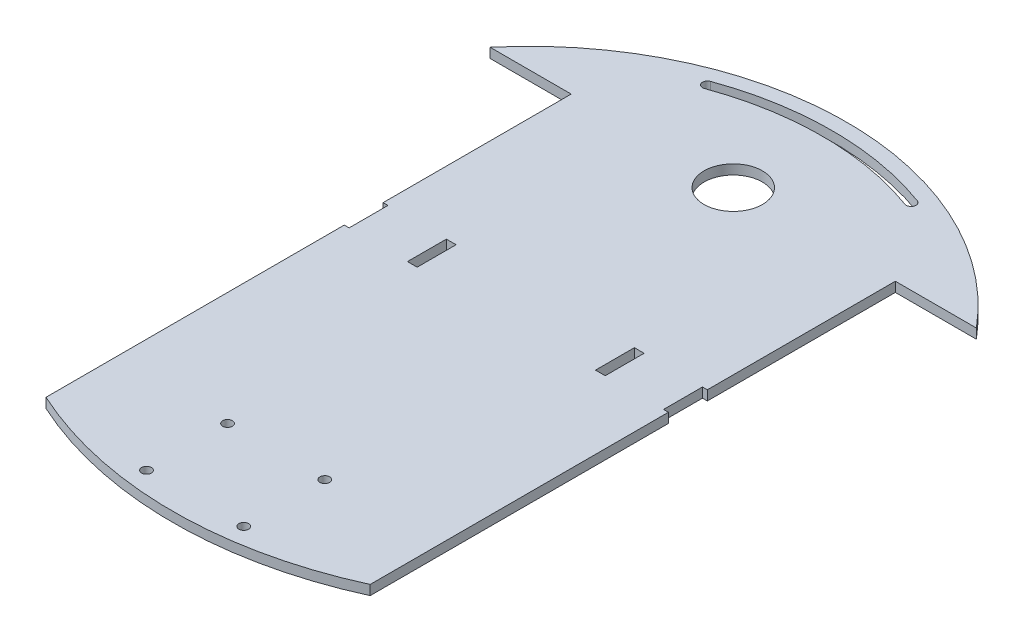
ISO-10303-21;
HEADER;
FILE_DESCRIPTION(('STEP AP214'),'2;1');
FILE_NAME('part.step','',(''),(''),'','','');
FILE_SCHEMA(('AUTOMOTIVE_DESIGN { 1 0 10303 214 1 1 1 1 }'));
ENDSEC;
DATA;
#1=APPLICATION_CONTEXT('core data for automotive mechanical design processes');
#2=APPLICATION_PROTOCOL_DEFINITION('international standard','automotive_design',2000,#1);
#3=PRODUCT_CONTEXT('',#1,'mechanical');
#4=PRODUCT('Part','Part','',(#3));
#5=PRODUCT_RELATED_PRODUCT_CATEGORY('part','',(#4));
#6=PRODUCT_DEFINITION_FORMATION('','',#4);
#7=PRODUCT_DEFINITION_CONTEXT('part definition',#1,'design');
#8=PRODUCT_DEFINITION('design','',#6,#7);
#9=PRODUCT_DEFINITION_SHAPE('','',#8);
#10=(LENGTH_UNIT() NAMED_UNIT(*) SI_UNIT(.MILLI.,.METRE.));
#11=(NAMED_UNIT(*) PLANE_ANGLE_UNIT() SI_UNIT($,.RADIAN.));
#12=(NAMED_UNIT(*) SI_UNIT($,.STERADIAN.) SOLID_ANGLE_UNIT());
#13=UNCERTAINTY_MEASURE_WITH_UNIT(LENGTH_MEASURE(1.E-05),#10,'distance_accuracy_value','');
#14=(GEOMETRIC_REPRESENTATION_CONTEXT(3) GLOBAL_UNCERTAINTY_ASSIGNED_CONTEXT((#13)) GLOBAL_UNIT_ASSIGNED_CONTEXT((#10,
#11,#12)) REPRESENTATION_CONTEXT('',''));
#15=CARTESIAN_POINT('',(0.,0.,0.));
#16=DIRECTION('',(0.,0.,1.));
#17=DIRECTION('',(1.,0.,0.));
#18=AXIS2_PLACEMENT_3D('',#15,#16,#17);
#19=CARTESIAN_POINT('',(0.,3.,-28.0871211463571));
#20=DIRECTION('',(0.,1.,0.));
#21=DIRECTION('',(0.,0.,1.));
#22=AXIS2_PLACEMENT_3D('',#19,#20,#21);
#23=PLANE('',#22);
#24=CARTESIAN_POINT('',(-15.,3.,60.));
#25=DIRECTION('',(0.,1.,0.));
#26=DIRECTION('',(0.,0.,-1.));
#27=AXIS2_PLACEMENT_3D('',#24,#25,#26);
#28=CIRCLE('',#27,1.5);
#29=CARTESIAN_POINT('',(-15.,3.,58.5));
#30=VERTEX_POINT('',#29);
#31=EDGE_CURVE('E863',#30,#30,#28,.T.);
#32=ORIENTED_EDGE('',*,*,#31,.F.);
#33=EDGE_LOOP('',(#32));
#34=FACE_BOUND('',#33,.T.);
#35=CARTESIAN_POINT('',(-15.,3.,85.));
#36=DIRECTION('',(0.,1.,0.));
#37=DIRECTION('',(0.,0.,-1.));
#38=AXIS2_PLACEMENT_3D('',#35,#36,#37);
#39=CIRCLE('',#38,1.5);
#40=CARTESIAN_POINT('',(-15.,3.,83.5));
#41=VERTEX_POINT('',#40);
#42=EDGE_CURVE('E867',#41,#41,#39,.T.);
#43=ORIENTED_EDGE('',*,*,#42,.F.);
#44=EDGE_LOOP('',(#43));
#45=FACE_BOUND('',#44,.T.);
#46=CARTESIAN_POINT('',(15.,3.,85.));
#47=DIRECTION('',(0.,1.,0.));
#48=DIRECTION('',(0.,0.,1.));
#49=AXIS2_PLACEMENT_3D('',#46,#47,#48);
#50=CIRCLE('',#49,1.5);
#51=CARTESIAN_POINT('',(15.,3.,86.5));
#52=VERTEX_POINT('',#51);
#53=EDGE_CURVE('E881',#52,#52,#50,.T.);
#54=ORIENTED_EDGE('',*,*,#53,.F.);
#55=EDGE_LOOP('',(#54));
#56=FACE_BOUND('',#55,.T.);
#57=CARTESIAN_POINT('',(15.,3.,60.));
#58=DIRECTION('',(0.,1.,0.));
#59=DIRECTION('',(0.,0.,1.));
#60=AXIS2_PLACEMENT_3D('',#57,#58,#59);
#61=CIRCLE('',#60,1.5);
#62=CARTESIAN_POINT('',(15.,3.,61.5));
#63=VERTEX_POINT('',#62);
#64=EDGE_CURVE('E873',#63,#63,#61,.T.);
#65=ORIENTED_EDGE('',*,*,#64,.F.);
#66=EDGE_LOOP('',(#65));
#67=FACE_BOUND('',#66,.T.);
#68=DIRECTION('',(0.,0.,-1.));
#69=VECTOR('',#68,1.);
#70=CARTESIAN_POINT('',(-27.5,3.,-11.));
#71=LINE('',#70,#69);
#72=CARTESIAN_POINT('',(-27.5,3.,-11.));
#73=VERTEX_POINT('',#72);
#74=CARTESIAN_POINT('',(-27.5,3.,-23.));
#75=VERTEX_POINT('',#74);
#76=EDGE_CURVE('E274',#73,#75,#71,.T.);
#77=ORIENTED_EDGE('',*,*,#76,.F.);
#78=DIRECTION('',(1.,0.,0.));
#79=VECTOR('',#78,1.);
#80=CARTESIAN_POINT('',(-30.5,3.,-11.));
#81=LINE('',#80,#79);
#82=CARTESIAN_POINT('',(-30.5,3.,-11.));
#83=VERTEX_POINT('',#82);
#84=EDGE_CURVE('E271',#83,#73,#81,.T.);
#85=ORIENTED_EDGE('',*,*,#84,.F.);
#86=DIRECTION('',(0.,0.,1.));
#87=VECTOR('',#86,1.);
#88=CARTESIAN_POINT('',(-30.5,3.,-11.));
#89=LINE('',#88,#87);
#90=CARTESIAN_POINT('',(-30.5,3.,-23.));
#91=VERTEX_POINT('',#90);
#92=EDGE_CURVE('E282',#91,#83,#89,.T.);
#93=ORIENTED_EDGE('',*,*,#92,.F.);
#94=DIRECTION('',(-1.,0.,0.));
#95=VECTOR('',#94,1.);
#96=CARTESIAN_POINT('',(-30.5,3.,-23.));
#97=LINE('',#96,#95);
#98=EDGE_CURVE('E278',#75,#91,#97,.T.);
#99=ORIENTED_EDGE('',*,*,#98,.F.);
#100=EDGE_LOOP('',(#77,#85,#93,#99));
#101=FACE_BOUND('',#100,.T.);
#102=DIRECTION('',(-1.,0.,0.));
#103=VECTOR('',#102,1.);
#104=CARTESIAN_POINT('',(30.5,3.,-23.));
#105=LINE('',#104,#103);
#106=CARTESIAN_POINT('',(30.5,3.,-23.));
#107=VERTEX_POINT('',#106);
#108=CARTESIAN_POINT('',(27.5,3.,-23.));
#109=VERTEX_POINT('',#108);
#110=EDGE_CURVE('E317',#107,#109,#105,.T.);
#111=ORIENTED_EDGE('',*,*,#110,.F.);
#112=DIRECTION('',(0.,0.,-1.));
#113=VECTOR('',#112,1.);
#114=CARTESIAN_POINT('',(30.5,3.,-11.));
#115=LINE('',#114,#113);
#116=CARTESIAN_POINT('',(30.5,3.,-11.));
#117=VERTEX_POINT('',#116);
#118=EDGE_CURVE('E314',#117,#107,#115,.T.);
#119=ORIENTED_EDGE('',*,*,#118,.F.);
#120=DIRECTION('',(1.,0.,0.));
#121=VECTOR('',#120,1.);
#122=CARTESIAN_POINT('',(30.5,3.,-11.));
#123=LINE('',#122,#121);
#124=CARTESIAN_POINT('',(27.5,3.,-11.));
#125=VERTEX_POINT('',#124);
#126=EDGE_CURVE('E325',#125,#117,#123,.T.);
#127=ORIENTED_EDGE('',*,*,#126,.F.);
#128=DIRECTION('',(0.,0.,1.));
#129=VECTOR('',#128,1.);
#130=CARTESIAN_POINT('',(27.5,3.,-11.));
#131=LINE('',#130,#129);
#132=EDGE_CURVE('E321',#109,#125,#131,.T.);
#133=ORIENTED_EDGE('',*,*,#132,.F.);
#134=EDGE_LOOP('',(#111,#119,#127,#133));
#135=FACE_BOUND('',#134,.T.);
#136=CARTESIAN_POINT('',(0.,3.,-28.0871211463571));
#137=DIRECTION('',(0.,1.,0.));
#138=DIRECTION('',(0.,0.,1.));
#139=AXIS2_PLACEMENT_3D('',#136,#137,#138);
#140=CIRCLE('',#139,120.);
#141=CARTESIAN_POINT('',(-50.,3.,81.));
#142=VERTEX_POINT('',#141);
#143=CARTESIAN_POINT('',(50.,3.,81.));
#144=VERTEX_POINT('',#143);
#145=EDGE_CURVE('E357',#142,#144,#140,.T.);
#146=ORIENTED_EDGE('',*,*,#145,.T.);
#147=DIRECTION('',(0.,0.,-1.));
#148=VECTOR('',#147,1.);
#149=CARTESIAN_POINT('',(50.,3.,81.));
#150=LINE('',#149,#148);
#151=CARTESIAN_POINT('',(50.,3.,-11.));
#152=VERTEX_POINT('',#151);
#153=EDGE_CURVE('E361',#144,#152,#150,.T.);
#154=ORIENTED_EDGE('',*,*,#153,.T.);
#155=DIRECTION('',(-1.,0.,0.));
#156=VECTOR('',#155,1.);
#157=CARTESIAN_POINT('',(48.5,3.,-11.));
#158=LINE('',#157,#156);
#159=CARTESIAN_POINT('',(48.5,3.,-11.));
#160=VERTEX_POINT('',#159);
#161=EDGE_CURVE('E365',#152,#160,#158,.T.);
#162=ORIENTED_EDGE('',*,*,#161,.T.);
#163=DIRECTION('',(0.,0.,-1.));
#164=VECTOR('',#163,1.);
#165=CARTESIAN_POINT('',(48.5,3.,-23.));
#166=LINE('',#165,#164);
#167=CARTESIAN_POINT('',(48.5,3.,-23.));
#168=VERTEX_POINT('',#167);
#169=EDGE_CURVE('E368',#160,#168,#166,.T.);
#170=ORIENTED_EDGE('',*,*,#169,.T.);
#171=DIRECTION('',(1.,0.,0.));
#172=VECTOR('',#171,1.);
#173=CARTESIAN_POINT('',(50.,3.,-23.));
#174=LINE('',#173,#172);
#175=CARTESIAN_POINT('',(50.,3.,-23.));
#176=VERTEX_POINT('',#175);
#177=EDGE_CURVE('E371',#168,#176,#174,.T.);
#178=ORIENTED_EDGE('',*,*,#177,.T.);
#179=DIRECTION('',(0.,0.,-1.));
#180=VECTOR('',#179,1.);
#181=CARTESIAN_POINT('',(50.,3.,-23.));
#182=LINE('',#181,#180);
#183=CARTESIAN_POINT('',(50.,3.,-81.));
#184=VERTEX_POINT('',#183);
#185=EDGE_CURVE('E374',#176,#184,#182,.T.);
#186=ORIENTED_EDGE('',*,*,#185,.T.);
#187=DIRECTION('',(1.,0.,0.));
#188=VECTOR('',#187,1.);
#189=CARTESIAN_POINT('',(50.,3.,-81.));
#190=LINE('',#189,#188);
#191=CARTESIAN_POINT('',(75.,3.,-81.));
#192=VERTEX_POINT('',#191);
#193=EDGE_CURVE('E377',#184,#192,#190,.T.);
#194=ORIENTED_EDGE('',*,*,#193,.T.);
#195=CARTESIAN_POINT('',(0.,3.,-18.1428571428571));
#196=DIRECTION('',(0.,1.,0.));
#197=DIRECTION('',(0.,0.,-1.));
#198=AXIS2_PLACEMENT_3D('',#195,#196,#197);
#199=CIRCLE('',#198,97.8571428571429);
#200=CARTESIAN_POINT('',(-75.,3.,-81.));
#201=VERTEX_POINT('',#200);
#202=EDGE_CURVE('E380',#192,#201,#199,.T.);
#203=ORIENTED_EDGE('',*,*,#202,.T.);
#204=DIRECTION('',(1.,0.,0.));
#205=VECTOR('',#204,1.);
#206=CARTESIAN_POINT('',(-50.,3.,-81.));
#207=LINE('',#206,#205);
#208=CARTESIAN_POINT('',(-50.,3.,-81.));
#209=VERTEX_POINT('',#208);
#210=EDGE_CURVE('E383',#201,#209,#207,.T.);
#211=ORIENTED_EDGE('',*,*,#210,.T.);
#212=DIRECTION('',(0.,0.,1.));
#213=VECTOR('',#212,1.);
#214=CARTESIAN_POINT('',(-50.,3.,-23.));
#215=LINE('',#214,#213);
#216=CARTESIAN_POINT('',(-50.,3.,-23.));
#217=VERTEX_POINT('',#216);
#218=EDGE_CURVE('E386',#209,#217,#215,.T.);
#219=ORIENTED_EDGE('',*,*,#218,.T.);
#220=DIRECTION('',(1.,0.,0.));
#221=VECTOR('',#220,1.);
#222=CARTESIAN_POINT('',(-50.,3.,-23.));
#223=LINE('',#222,#221);
#224=CARTESIAN_POINT('',(-48.5,3.,-23.));
#225=VERTEX_POINT('',#224);
#226=EDGE_CURVE('E389',#217,#225,#223,.T.);
#227=ORIENTED_EDGE('',*,*,#226,.T.);
#228=DIRECTION('',(0.,0.,1.));
#229=VECTOR('',#228,1.);
#230=CARTESIAN_POINT('',(-48.5,3.,-23.));
#231=LINE('',#230,#229);
#232=CARTESIAN_POINT('',(-48.5,3.,-11.));
#233=VERTEX_POINT('',#232);
#234=EDGE_CURVE('E392',#225,#233,#231,.T.);
#235=ORIENTED_EDGE('',*,*,#234,.T.);
#236=DIRECTION('',(-1.,0.,0.));
#237=VECTOR('',#236,1.);
#238=CARTESIAN_POINT('',(-48.5,3.,-11.));
#239=LINE('',#238,#237);
#240=CARTESIAN_POINT('',(-50.,3.,-11.));
#241=VERTEX_POINT('',#240);
#242=EDGE_CURVE('E395',#233,#241,#239,.T.);
#243=ORIENTED_EDGE('',*,*,#242,.T.);
#244=DIRECTION('',(0.,0.,1.));
#245=VECTOR('',#244,1.);
#246=CARTESIAN_POINT('',(-50.,3.,81.));
#247=LINE('',#246,#245);
#248=EDGE_CURVE('E398',#241,#142,#247,.T.);
#249=ORIENTED_EDGE('',*,*,#248,.T.);
#250=EDGE_LOOP('',(#146,#154,#162,#170,#178,#186,#194,#203,#211,#219,#227,#235,#243,#249));
#251=FACE_BOUND('',#250,.T.);
#252=CARTESIAN_POINT('',(0.,3.,-81.));
#253=DIRECTION('',(0.,1.,0.));
#254=DIRECTION('',(0.,0.,1.));
#255=AXIS2_PLACEMENT_3D('',#252,#253,#254);
#256=CIRCLE('',#255,9.);
#257=CARTESIAN_POINT('',(0.,3.,-72.));
#258=VERTEX_POINT('',#257);
#259=EDGE_CURVE('E263',#258,#258,#256,.T.);
#260=ORIENTED_EDGE('',*,*,#259,.F.);
#261=EDGE_LOOP('',(#260));
#262=FACE_BOUND('',#261,.T.);
#263=CARTESIAN_POINT('',(0.,3.,-18.1428571428571));
#264=DIRECTION('',(0.,1.,0.));
#265=DIRECTION('',(0.,0.,1.));
#266=AXIS2_PLACEMENT_3D('',#263,#264,#265);
#267=CIRCLE('',#266,93.3571428571429);
#268=CARTESIAN_POINT('',(31.9300233804749,3.,-105.86987538337));
#269=VERTEX_POINT('',#268);
#270=CARTESIAN_POINT('',(-31.9300233804749,3.,-105.86987538337));
#271=VERTEX_POINT('',#270);
#272=EDGE_CURVE('E222',#269,#271,#267,.T.);
#273=ORIENTED_EDGE('',*,*,#272,.F.);
#274=CARTESIAN_POINT('',(31.4169931654865,3.,-104.460336452191));
#275=DIRECTION('',(0.,1.,0.));
#276=DIRECTION('',(0.,0.,1.));
#277=AXIS2_PLACEMENT_3D('',#274,#275,#276);
#278=CIRCLE('',#277,1.50000000000001);
#279=CARTESIAN_POINT('',(30.9039629504979,3.,-103.050797521012));
#280=VERTEX_POINT('',#279);
#281=EDGE_CURVE('E213',#280,#269,#278,.T.);
#282=ORIENTED_EDGE('',*,*,#281,.F.);
#283=CARTESIAN_POINT('',(0.,3.,-18.1428571428571));
#284=DIRECTION('',(0.,-1.,0.));
#285=DIRECTION('',(0.,0.,1.));
#286=AXIS2_PLACEMENT_3D('',#283,#284,#285);
#287=CIRCLE('',#286,90.3571428571428);
#288=CARTESIAN_POINT('',(-30.9039629504979,3.,-103.050797521012));
#289=VERTEX_POINT('',#288);
#290=EDGE_CURVE('E239',#289,#280,#287,.T.);
#291=ORIENTED_EDGE('',*,*,#290,.F.);
#292=CARTESIAN_POINT('',(-31.4169931654865,3.,-104.460336452191));
#293=DIRECTION('',(0.,1.,0.));
#294=DIRECTION('',(0.,0.,1.));
#295=AXIS2_PLACEMENT_3D('',#292,#293,#294);
#296=CIRCLE('',#295,1.50000000000001);
#297=EDGE_CURVE('E235',#271,#289,#296,.T.);
#298=ORIENTED_EDGE('',*,*,#297,.F.);
#299=EDGE_LOOP('',(#273,#282,#291,#298));
#300=FACE_BOUND('',#299,.T.);
#301=ADVANCED_FACE('F39',(#34,#45,#56,#67,#101,#135,#251,#262,#300),#23,.T.);
#302=CARTESIAN_POINT('',(0.,0.,-28.0871211463571));
#303=DIRECTION('',(0.,1.,0.));
#304=DIRECTION('',(0.,0.,1.));
#305=AXIS2_PLACEMENT_3D('',#302,#303,#304);
#306=PLANE('',#305);
#307=CARTESIAN_POINT('',(-15.,0.,60.));
#308=DIRECTION('',(0.,1.,0.));
#309=DIRECTION('',(0.,0.,-1.));
#310=AXIS2_PLACEMENT_3D('',#307,#308,#309);
#311=CIRCLE('',#310,1.5);
#312=CARTESIAN_POINT('',(-15.,0.,58.5));
#313=VERTEX_POINT('',#312);
#314=EDGE_CURVE('E861',#313,#313,#311,.T.);
#315=ORIENTED_EDGE('',*,*,#314,.T.);
#316=EDGE_LOOP('',(#315));
#317=FACE_BOUND('',#316,.T.);
#318=CARTESIAN_POINT('',(-15.,0.,85.));
#319=DIRECTION('',(0.,1.,0.));
#320=DIRECTION('',(0.,0.,-1.));
#321=AXIS2_PLACEMENT_3D('',#318,#319,#320);
#322=CIRCLE('',#321,1.5);
#323=CARTESIAN_POINT('',(-15.,0.,83.5));
#324=VERTEX_POINT('',#323);
#325=EDGE_CURVE('E887',#324,#324,#322,.T.);
#326=ORIENTED_EDGE('',*,*,#325,.T.);
#327=EDGE_LOOP('',(#326));
#328=FACE_BOUND('',#327,.T.);
#329=CARTESIAN_POINT('',(15.,0.,85.));
#330=DIRECTION('',(0.,1.,0.));
#331=DIRECTION('',(0.,0.,1.));
#332=AXIS2_PLACEMENT_3D('',#329,#330,#331);
#333=CIRCLE('',#332,1.5);
#334=CARTESIAN_POINT('',(15.,0.,86.5));
#335=VERTEX_POINT('',#334);
#336=EDGE_CURVE('E876',#335,#335,#333,.T.);
#337=ORIENTED_EDGE('',*,*,#336,.T.);
#338=EDGE_LOOP('',(#337));
#339=FACE_BOUND('',#338,.T.);
#340=CARTESIAN_POINT('',(15.,0.,60.));
#341=DIRECTION('',(0.,1.,0.));
#342=DIRECTION('',(0.,0.,1.));
#343=AXIS2_PLACEMENT_3D('',#340,#341,#342);
#344=CIRCLE('',#343,1.5);
#345=CARTESIAN_POINT('',(15.,0.,61.5));
#346=VERTEX_POINT('',#345);
#347=EDGE_CURVE('E247',#346,#346,#344,.T.);
#348=ORIENTED_EDGE('',*,*,#347,.T.);
#349=EDGE_LOOP('',(#348));
#350=FACE_BOUND('',#349,.T.);
#351=CARTESIAN_POINT('',(0.,0.,-81.));
#352=DIRECTION('',(0.,1.,0.));
#353=DIRECTION('',(0.,0.,1.));
#354=AXIS2_PLACEMENT_3D('',#351,#352,#353);
#355=CIRCLE('',#354,9.);
#356=CARTESIAN_POINT('',(0.,0.,-72.));
#357=VERTEX_POINT('',#356);
#358=EDGE_CURVE('E231',#357,#357,#355,.T.);
#359=ORIENTED_EDGE('',*,*,#358,.T.);
#360=EDGE_LOOP('',(#359));
#361=FACE_BOUND('',#360,.T.);
#362=DIRECTION('',(1.,0.,0.));
#363=VECTOR('',#362,1.);
#364=CARTESIAN_POINT('',(-30.5,0.,-11.));
#365=LINE('',#364,#363);
#366=CARTESIAN_POINT('',(-30.5,0.,-11.));
#367=VERTEX_POINT('',#366);
#368=CARTESIAN_POINT('',(-27.5,0.,-11.));
#369=VERTEX_POINT('',#368);
#370=EDGE_CURVE('E267',#367,#369,#365,.T.);
#371=ORIENTED_EDGE('',*,*,#370,.T.);
#372=DIRECTION('',(0.,0.,-1.));
#373=VECTOR('',#372,1.);
#374=CARTESIAN_POINT('',(-27.5,0.,-11.));
#375=LINE('',#374,#373);
#376=CARTESIAN_POINT('',(-27.5,0.,-23.));
#377=VERTEX_POINT('',#376);
#378=EDGE_CURVE('E289',#369,#377,#375,.T.);
#379=ORIENTED_EDGE('',*,*,#378,.T.);
#380=DIRECTION('',(-1.,0.,0.));
#381=VECTOR('',#380,1.);
#382=CARTESIAN_POINT('',(-30.5,0.,-23.));
#383=LINE('',#382,#381);
#384=CARTESIAN_POINT('',(-30.5,0.,-23.));
#385=VERTEX_POINT('',#384);
#386=EDGE_CURVE('E293',#377,#385,#383,.T.);
#387=ORIENTED_EDGE('',*,*,#386,.T.);
#388=DIRECTION('',(0.,0.,1.));
#389=VECTOR('',#388,1.);
#390=CARTESIAN_POINT('',(-30.5,0.,-11.));
#391=LINE('',#390,#389);
#392=EDGE_CURVE('E275',#385,#367,#391,.T.);
#393=ORIENTED_EDGE('',*,*,#392,.T.);
#394=EDGE_LOOP('',(#371,#379,#387,#393));
#395=FACE_BOUND('',#394,.T.);
#396=CARTESIAN_POINT('',(0.,0.,-28.0871211463571));
#397=DIRECTION('',(0.,1.,0.));
#398=DIRECTION('',(0.,0.,1.));
#399=AXIS2_PLACEMENT_3D('',#396,#397,#398);
#400=CIRCLE('',#399,120.);
#401=CARTESIAN_POINT('',(-50.,0.,81.));
#402=VERTEX_POINT('',#401);
#403=CARTESIAN_POINT('',(50.,0.,81.));
#404=VERTEX_POINT('',#403);
#405=EDGE_CURVE('E356',#402,#404,#400,.T.);
#406=ORIENTED_EDGE('',*,*,#405,.F.);
#407=DIRECTION('',(0.,0.,1.));
#408=VECTOR('',#407,1.);
#409=CARTESIAN_POINT('',(-50.,0.,81.));
#410=LINE('',#409,#408);
#411=CARTESIAN_POINT('',(-50.,0.,-11.));
#412=VERTEX_POINT('',#411);
#413=EDGE_CURVE('E362',#412,#402,#410,.T.);
#414=ORIENTED_EDGE('',*,*,#413,.F.);
#415=DIRECTION('',(-1.,0.,0.));
#416=VECTOR('',#415,1.);
#417=CARTESIAN_POINT('',(-48.5,0.,-11.));
#418=LINE('',#417,#416);
#419=CARTESIAN_POINT('',(-48.5,0.,-11.));
#420=VERTEX_POINT('',#419);
#421=EDGE_CURVE('E438',#420,#412,#418,.T.);
#422=ORIENTED_EDGE('',*,*,#421,.F.);
#423=DIRECTION('',(0.,0.,1.));
#424=VECTOR('',#423,1.);
#425=CARTESIAN_POINT('',(-48.5,0.,-23.));
#426=LINE('',#425,#424);
#427=CARTESIAN_POINT('',(-48.5,0.,-23.));
#428=VERTEX_POINT('',#427);
#429=EDGE_CURVE('E435',#428,#420,#426,.T.);
#430=ORIENTED_EDGE('',*,*,#429,.F.);
#431=DIRECTION('',(1.,0.,0.));
#432=VECTOR('',#431,1.);
#433=CARTESIAN_POINT('',(-50.,0.,-23.));
#434=LINE('',#433,#432);
#435=CARTESIAN_POINT('',(-50.,0.,-23.));
#436=VERTEX_POINT('',#435);
#437=EDGE_CURVE('E432',#436,#428,#434,.T.);
#438=ORIENTED_EDGE('',*,*,#437,.F.);
#439=DIRECTION('',(0.,0.,1.));
#440=VECTOR('',#439,1.);
#441=CARTESIAN_POINT('',(-50.,0.,-23.));
#442=LINE('',#441,#440);
#443=CARTESIAN_POINT('',(-50.,0.,-81.));
#444=VERTEX_POINT('',#443);
#445=EDGE_CURVE('E429',#444,#436,#442,.T.);
#446=ORIENTED_EDGE('',*,*,#445,.F.);
#447=DIRECTION('',(1.,0.,0.));
#448=VECTOR('',#447,1.);
#449=CARTESIAN_POINT('',(-50.,0.,-81.));
#450=LINE('',#449,#448);
#451=CARTESIAN_POINT('',(-75.,0.,-81.));
#452=VERTEX_POINT('',#451);
#453=EDGE_CURVE('E426',#452,#444,#450,.T.);
#454=ORIENTED_EDGE('',*,*,#453,.F.);
#455=CARTESIAN_POINT('',(0.,0.,-18.1428571428571));
#456=DIRECTION('',(0.,1.,0.));
#457=DIRECTION('',(0.,0.,-1.));
#458=AXIS2_PLACEMENT_3D('',#455,#456,#457);
#459=CIRCLE('',#458,97.8571428571429);
#460=CARTESIAN_POINT('',(75.,0.,-81.));
#461=VERTEX_POINT('',#460);
#462=EDGE_CURVE('E423',#461,#452,#459,.T.);
#463=ORIENTED_EDGE('',*,*,#462,.F.);
#464=DIRECTION('',(1.,0.,0.));
#465=VECTOR('',#464,1.);
#466=CARTESIAN_POINT('',(50.,0.,-81.));
#467=LINE('',#466,#465);
#468=CARTESIAN_POINT('',(50.,0.,-81.));
#469=VERTEX_POINT('',#468);
#470=EDGE_CURVE('E420',#469,#461,#467,.T.);
#471=ORIENTED_EDGE('',*,*,#470,.F.);
#472=DIRECTION('',(0.,0.,-1.));
#473=VECTOR('',#472,1.);
#474=CARTESIAN_POINT('',(50.,0.,-23.));
#475=LINE('',#474,#473);
#476=CARTESIAN_POINT('',(50.,0.,-23.));
#477=VERTEX_POINT('',#476);
#478=EDGE_CURVE('E417',#477,#469,#475,.T.);
#479=ORIENTED_EDGE('',*,*,#478,.F.);
#480=DIRECTION('',(1.,0.,0.));
#481=VECTOR('',#480,1.);
#482=CARTESIAN_POINT('',(50.,0.,-23.));
#483=LINE('',#482,#481);
#484=CARTESIAN_POINT('',(48.5,0.,-23.));
#485=VERTEX_POINT('',#484);
#486=EDGE_CURVE('E414',#485,#477,#483,.T.);
#487=ORIENTED_EDGE('',*,*,#486,.F.);
#488=DIRECTION('',(0.,0.,-1.));
#489=VECTOR('',#488,1.);
#490=CARTESIAN_POINT('',(48.5,0.,-23.));
#491=LINE('',#490,#489);
#492=CARTESIAN_POINT('',(48.5,0.,-11.));
#493=VERTEX_POINT('',#492);
#494=EDGE_CURVE('E411',#493,#485,#491,.T.);
#495=ORIENTED_EDGE('',*,*,#494,.F.);
#496=DIRECTION('',(-1.,0.,0.));
#497=VECTOR('',#496,1.);
#498=CARTESIAN_POINT('',(48.5,0.,-11.));
#499=LINE('',#498,#497);
#500=CARTESIAN_POINT('',(50.,0.,-11.));
#501=VERTEX_POINT('',#500);
#502=EDGE_CURVE('E408',#501,#493,#499,.T.);
#503=ORIENTED_EDGE('',*,*,#502,.F.);
#504=DIRECTION('',(0.,0.,-1.));
#505=VECTOR('',#504,1.);
#506=CARTESIAN_POINT('',(50.,0.,81.));
#507=LINE('',#506,#505);
#508=EDGE_CURVE('E405',#404,#501,#507,.T.);
#509=ORIENTED_EDGE('',*,*,#508,.F.);
#510=EDGE_LOOP('',(#406,#414,#422,#430,#438,#446,#454,#463,#471,#479,#487,#495,#503,#509));
#511=FACE_BOUND('',#510,.T.);
#512=DIRECTION('',(0.,0.,-1.));
#513=VECTOR('',#512,1.);
#514=CARTESIAN_POINT('',(30.5,0.,-11.));
#515=LINE('',#514,#513);
#516=CARTESIAN_POINT('',(30.5,0.,-11.));
#517=VERTEX_POINT('',#516);
#518=CARTESIAN_POINT('',(30.5,0.,-23.));
#519=VERTEX_POINT('',#518);
#520=EDGE_CURVE('E313',#517,#519,#515,.T.);
#521=ORIENTED_EDGE('',*,*,#520,.T.);
#522=DIRECTION('',(-1.,0.,0.));
#523=VECTOR('',#522,1.);
#524=CARTESIAN_POINT('',(30.5,0.,-23.));
#525=LINE('',#524,#523);
#526=CARTESIAN_POINT('',(27.5,0.,-23.));
#527=VERTEX_POINT('',#526);
#528=EDGE_CURVE('E332',#519,#527,#525,.T.);
#529=ORIENTED_EDGE('',*,*,#528,.T.);
#530=DIRECTION('',(0.,0.,1.));
#531=VECTOR('',#530,1.);
#532=CARTESIAN_POINT('',(27.5,0.,-11.));
#533=LINE('',#532,#531);
#534=CARTESIAN_POINT('',(27.5,0.,-11.));
#535=VERTEX_POINT('',#534);
#536=EDGE_CURVE('E336',#527,#535,#533,.T.);
#537=ORIENTED_EDGE('',*,*,#536,.T.);
#538=DIRECTION('',(1.,0.,0.));
#539=VECTOR('',#538,1.);
#540=CARTESIAN_POINT('',(30.5,0.,-11.));
#541=LINE('',#540,#539);
#542=EDGE_CURVE('E318',#535,#517,#541,.T.);
#543=ORIENTED_EDGE('',*,*,#542,.T.);
#544=EDGE_LOOP('',(#521,#529,#537,#543));
#545=FACE_BOUND('',#544,.T.);
#546=CARTESIAN_POINT('',(31.4169931654865,0.,-104.460336452191));
#547=DIRECTION('',(0.,1.,0.));
#548=DIRECTION('',(0.,0.,1.));
#549=AXIS2_PLACEMENT_3D('',#546,#547,#548);
#550=CIRCLE('',#549,1.50000000000001);
#551=CARTESIAN_POINT('',(30.9039629504979,0.,-103.050797521012));
#552=VERTEX_POINT('',#551);
#553=CARTESIAN_POINT('',(31.9300233804749,0.,-105.86987538337));
#554=VERTEX_POINT('',#553);
#555=EDGE_CURVE('E63',#552,#554,#550,.T.);
#556=ORIENTED_EDGE('',*,*,#555,.T.);
#557=CARTESIAN_POINT('',(0.,0.,-18.1428571428571));
#558=DIRECTION('',(0.,1.,0.));
#559=DIRECTION('',(0.,0.,1.));
#560=AXIS2_PLACEMENT_3D('',#557,#558,#559);
#561=CIRCLE('',#560,93.3571428571429);
#562=CARTESIAN_POINT('',(-31.9300233804749,0.,-105.86987538337));
#563=VERTEX_POINT('',#562);
#564=EDGE_CURVE('E229',#554,#563,#561,.T.);
#565=ORIENTED_EDGE('',*,*,#564,.T.);
#566=CARTESIAN_POINT('',(-31.4169931654865,0.,-104.460336452191));
#567=DIRECTION('',(0.,1.,0.));
#568=DIRECTION('',(0.,0.,1.));
#569=AXIS2_PLACEMENT_3D('',#566,#567,#568);
#570=CIRCLE('',#569,1.50000000000001);
#571=CARTESIAN_POINT('',(-30.9039629504979,0.,-103.050797521012));
#572=VERTEX_POINT('',#571);
#573=EDGE_CURVE('E250',#563,#572,#570,.T.);
#574=ORIENTED_EDGE('',*,*,#573,.T.);
#575=CARTESIAN_POINT('',(0.,0.,-18.1428571428571));
#576=DIRECTION('',(0.,-1.,0.));
#577=DIRECTION('',(0.,0.,1.));
#578=AXIS2_PLACEMENT_3D('',#575,#576,#577);
#579=CIRCLE('',#578,90.3571428571428);
#580=EDGE_CURVE('E223',#572,#552,#579,.T.);
#581=ORIENTED_EDGE('',*,*,#580,.T.);
#582=EDGE_LOOP('',(#556,#565,#574,#581));
#583=FACE_BOUND('',#582,.T.);
#584=ADVANCED_FACE('F501',(#317,#328,#339,#350,#361,#395,#511,#545,#583),#306,.F.);
#585=CARTESIAN_POINT('',(0.,3.,-28.0871211463571));
#586=DIRECTION('',(0.,-1.,0.));
#587=DIRECTION('',(0.,0.,-1.));
#588=AXIS2_PLACEMENT_3D('',#585,#586,#587);
#589=CYLINDRICAL_SURFACE('',#588,120.);
#590=ORIENTED_EDGE('',*,*,#405,.T.);
#591=DIRECTION('',(0.,-1.,0.));
#592=VECTOR('',#591,1.);
#593=CARTESIAN_POINT('',(50.,3.,81.));
#594=LINE('',#593,#592);
#595=EDGE_CURVE('E11',#144,#404,#594,.T.);
#596=ORIENTED_EDGE('',*,*,#595,.F.);
#597=ORIENTED_EDGE('',*,*,#145,.F.);
#598=DIRECTION('',(0.,-1.,0.));
#599=VECTOR('',#598,1.);
#600=CARTESIAN_POINT('',(-50.,3.,81.));
#601=LINE('',#600,#599);
#602=EDGE_CURVE('E401',#142,#402,#601,.T.);
#603=ORIENTED_EDGE('',*,*,#602,.T.);
#604=EDGE_LOOP('',(#590,#596,#597,#603));
#605=FACE_BOUND('',#604,.T.);
#606=ADVANCED_FACE('F41',(#605),#589,.T.);
#607=CARTESIAN_POINT('',(50.,3.,81.));
#608=DIRECTION('',(-1.,0.,0.));
#609=DIRECTION('',(0.,0.,1.));
#610=AXIS2_PLACEMENT_3D('',#607,#608,#609);
#611=PLANE('',#610);
#612=ORIENTED_EDGE('',*,*,#508,.T.);
#613=DIRECTION('',(0.,-1.,0.));
#614=VECTOR('',#613,1.);
#615=CARTESIAN_POINT('',(50.,3.,-11.));
#616=LINE('',#615,#614);
#617=EDGE_CURVE('E48',#152,#501,#616,.T.);
#618=ORIENTED_EDGE('',*,*,#617,.F.);
#619=ORIENTED_EDGE('',*,*,#153,.F.);
#620=ORIENTED_EDGE('',*,*,#595,.T.);
#621=EDGE_LOOP('',(#612,#618,#619,#620));
#622=FACE_BOUND('',#621,.T.);
#623=ADVANCED_FACE('F519',(#622),#611,.F.);
#624=CARTESIAN_POINT('',(48.5,3.,-11.));
#625=DIRECTION('',(0.,0.,1.));
#626=DIRECTION('',(1.,0.,0.));
#627=AXIS2_PLACEMENT_3D('',#624,#625,#626);
#628=PLANE('',#627);
#629=ORIENTED_EDGE('',*,*,#502,.T.);
#630=DIRECTION('',(0.,-1.,0.));
#631=VECTOR('',#630,1.);
#632=CARTESIAN_POINT('',(48.5,3.,-11.));
#633=LINE('',#632,#631);
#634=EDGE_CURVE('E486',#160,#493,#633,.T.);
#635=ORIENTED_EDGE('',*,*,#634,.F.);
#636=ORIENTED_EDGE('',*,*,#161,.F.);
#637=ORIENTED_EDGE('',*,*,#617,.T.);
#638=EDGE_LOOP('',(#629,#635,#636,#637));
#639=FACE_BOUND('',#638,.T.);
#640=ADVANCED_FACE('F495',(#639),#628,.F.);
#641=CARTESIAN_POINT('',(48.5,3.,-23.));
#642=DIRECTION('',(-1.,0.,0.));
#643=DIRECTION('',(0.,0.,1.));
#644=AXIS2_PLACEMENT_3D('',#641,#642,#643);
#645=PLANE('',#644);
#646=ORIENTED_EDGE('',*,*,#494,.T.);
#647=DIRECTION('',(0.,-1.,0.));
#648=VECTOR('',#647,1.);
#649=CARTESIAN_POINT('',(48.5,3.,-23.));
#650=LINE('',#649,#648);
#651=EDGE_CURVE('E482',#168,#485,#650,.T.);
#652=ORIENTED_EDGE('',*,*,#651,.F.);
#653=ORIENTED_EDGE('',*,*,#169,.F.);
#654=ORIENTED_EDGE('',*,*,#634,.T.);
#655=EDGE_LOOP('',(#646,#652,#653,#654));
#656=FACE_BOUND('',#655,.T.);
#657=ADVANCED_FACE('F507',(#656),#645,.F.);
#658=CARTESIAN_POINT('',(50.,3.,-23.));
#659=DIRECTION('',(0.,0.,-1.));
#660=DIRECTION('',(-1.,0.,0.));
#661=AXIS2_PLACEMENT_3D('',#658,#659,#660);
#662=PLANE('',#661);
#663=ORIENTED_EDGE('',*,*,#486,.T.);
#664=DIRECTION('',(0.,-1.,0.));
#665=VECTOR('',#664,1.);
#666=CARTESIAN_POINT('',(50.,3.,-23.));
#667=LINE('',#666,#665);
#668=EDGE_CURVE('E478',#176,#477,#667,.T.);
#669=ORIENTED_EDGE('',*,*,#668,.F.);
#670=ORIENTED_EDGE('',*,*,#177,.F.);
#671=ORIENTED_EDGE('',*,*,#651,.T.);
#672=EDGE_LOOP('',(#663,#669,#670,#671));
#673=FACE_BOUND('',#672,.T.);
#674=ADVANCED_FACE('F511',(#673),#662,.F.);
#675=CARTESIAN_POINT('',(50.,3.,-23.));
#676=DIRECTION('',(-1.,0.,0.));
#677=DIRECTION('',(0.,0.,1.));
#678=AXIS2_PLACEMENT_3D('',#675,#676,#677);
#679=PLANE('',#678);
#680=ORIENTED_EDGE('',*,*,#478,.T.);
#681=DIRECTION('',(0.,-1.,0.));
#682=VECTOR('',#681,1.);
#683=CARTESIAN_POINT('',(50.,3.,-81.));
#684=LINE('',#683,#682);
#685=EDGE_CURVE('E474',#184,#469,#684,.T.);
#686=ORIENTED_EDGE('',*,*,#685,.F.);
#687=ORIENTED_EDGE('',*,*,#185,.F.);
#688=ORIENTED_EDGE('',*,*,#668,.T.);
#689=EDGE_LOOP('',(#680,#686,#687,#688));
#690=FACE_BOUND('',#689,.T.);
#691=ADVANCED_FACE('F562',(#690),#679,.F.);
#692=CARTESIAN_POINT('',(50.,3.,-81.));
#693=DIRECTION('',(0.,0.,-1.));
#694=DIRECTION('',(-1.,0.,0.));
#695=AXIS2_PLACEMENT_3D('',#692,#693,#694);
#696=PLANE('',#695);
#697=ORIENTED_EDGE('',*,*,#470,.T.);
#698=DIRECTION('',(0.,-1.,0.));
#699=VECTOR('',#698,1.);
#700=CARTESIAN_POINT('',(75.,3.,-81.));
#701=LINE('',#700,#699);
#702=EDGE_CURVE('E470',#192,#461,#701,.T.);
#703=ORIENTED_EDGE('',*,*,#702,.F.);
#704=ORIENTED_EDGE('',*,*,#193,.F.);
#705=ORIENTED_EDGE('',*,*,#685,.T.);
#706=EDGE_LOOP('',(#697,#703,#704,#705));
#707=FACE_BOUND('',#706,.T.);
#708=ADVANCED_FACE('F560',(#707),#696,.F.);
#709=CARTESIAN_POINT('',(0.,3.,-18.1428571428571));
#710=DIRECTION('',(0.,-1.,0.));
#711=DIRECTION('',(0.,0.,-1.));
#712=AXIS2_PLACEMENT_3D('',#709,#710,#711);
#713=CYLINDRICAL_SURFACE('',#712,97.8571428571429);
#714=ORIENTED_EDGE('',*,*,#462,.T.);
#715=DIRECTION('',(0.,-1.,0.));
#716=VECTOR('',#715,1.);
#717=CARTESIAN_POINT('',(-75.,3.,-81.));
#718=LINE('',#717,#716);
#719=EDGE_CURVE('E466',#201,#452,#718,.T.);
#720=ORIENTED_EDGE('',*,*,#719,.F.);
#721=ORIENTED_EDGE('',*,*,#202,.F.);
#722=ORIENTED_EDGE('',*,*,#702,.T.);
#723=EDGE_LOOP('',(#714,#720,#721,#722));
#724=FACE_BOUND('',#723,.T.);
#725=ADVANCED_FACE('F555',(#724),#713,.T.);
#726=CARTESIAN_POINT('',(-50.,3.,-81.));
#727=DIRECTION('',(0.,0.,-1.));
#728=DIRECTION('',(-1.,0.,0.));
#729=AXIS2_PLACEMENT_3D('',#726,#727,#728);
#730=PLANE('',#729);
#731=ORIENTED_EDGE('',*,*,#453,.T.);
#732=DIRECTION('',(0.,-1.,0.));
#733=VECTOR('',#732,1.);
#734=CARTESIAN_POINT('',(-50.,3.,-81.));
#735=LINE('',#734,#733);
#736=EDGE_CURVE('E462',#209,#444,#735,.T.);
#737=ORIENTED_EDGE('',*,*,#736,.F.);
#738=ORIENTED_EDGE('',*,*,#210,.F.);
#739=ORIENTED_EDGE('',*,*,#719,.T.);
#740=EDGE_LOOP('',(#731,#737,#738,#739));
#741=FACE_BOUND('',#740,.T.);
#742=ADVANCED_FACE('F550',(#741),#730,.F.);
#743=CARTESIAN_POINT('',(-50.,3.,-23.));
#744=DIRECTION('',(1.,0.,0.));
#745=DIRECTION('',(0.,0.,-1.));
#746=AXIS2_PLACEMENT_3D('',#743,#744,#745);
#747=PLANE('',#746);
#748=ORIENTED_EDGE('',*,*,#445,.T.);
#749=DIRECTION('',(0.,-1.,0.));
#750=VECTOR('',#749,1.);
#751=CARTESIAN_POINT('',(-50.,3.,-23.));
#752=LINE('',#751,#750);
#753=EDGE_CURVE('E458',#217,#436,#752,.T.);
#754=ORIENTED_EDGE('',*,*,#753,.F.);
#755=ORIENTED_EDGE('',*,*,#218,.F.);
#756=ORIENTED_EDGE('',*,*,#736,.T.);
#757=EDGE_LOOP('',(#748,#754,#755,#756));
#758=FACE_BOUND('',#757,.T.);
#759=ADVANCED_FACE('F546',(#758),#747,.F.);
#760=CARTESIAN_POINT('',(-50.,3.,-23.));
#761=DIRECTION('',(0.,0.,-1.));
#762=DIRECTION('',(-1.,0.,0.));
#763=AXIS2_PLACEMENT_3D('',#760,#761,#762);
#764=PLANE('',#763);
#765=ORIENTED_EDGE('',*,*,#437,.T.);
#766=DIRECTION('',(0.,-1.,0.));
#767=VECTOR('',#766,1.);
#768=CARTESIAN_POINT('',(-48.5,3.,-23.));
#769=LINE('',#768,#767);
#770=EDGE_CURVE('E454',#225,#428,#769,.T.);
#771=ORIENTED_EDGE('',*,*,#770,.F.);
#772=ORIENTED_EDGE('',*,*,#226,.F.);
#773=ORIENTED_EDGE('',*,*,#753,.T.);
#774=EDGE_LOOP('',(#765,#771,#772,#773));
#775=FACE_BOUND('',#774,.T.);
#776=ADVANCED_FACE('F541',(#775),#764,.F.);
#777=CARTESIAN_POINT('',(-48.5,3.,-23.));
#778=DIRECTION('',(1.,0.,0.));
#779=DIRECTION('',(0.,0.,-1.));
#780=AXIS2_PLACEMENT_3D('',#777,#778,#779);
#781=PLANE('',#780);
#782=ORIENTED_EDGE('',*,*,#429,.T.);
#783=DIRECTION('',(0.,-1.,0.));
#784=VECTOR('',#783,1.);
#785=CARTESIAN_POINT('',(-48.5,3.,-11.));
#786=LINE('',#785,#784);
#787=EDGE_CURVE('E450',#233,#420,#786,.T.);
#788=ORIENTED_EDGE('',*,*,#787,.F.);
#789=ORIENTED_EDGE('',*,*,#234,.F.);
#790=ORIENTED_EDGE('',*,*,#770,.T.);
#791=EDGE_LOOP('',(#782,#788,#789,#790));
#792=FACE_BOUND('',#791,.T.);
#793=ADVANCED_FACE('F535',(#792),#781,.F.);
#794=CARTESIAN_POINT('',(-48.5,3.,-11.));
#795=DIRECTION('',(0.,0.,1.));
#796=DIRECTION('',(1.,0.,0.));
#797=AXIS2_PLACEMENT_3D('',#794,#795,#796);
#798=PLANE('',#797);
#799=ORIENTED_EDGE('',*,*,#421,.T.);
#800=DIRECTION('',(0.,-1.,0.));
#801=VECTOR('',#800,1.);
#802=CARTESIAN_POINT('',(-50.,3.,-11.));
#803=LINE('',#802,#801);
#804=EDGE_CURVE('E446',#241,#412,#803,.T.);
#805=ORIENTED_EDGE('',*,*,#804,.F.);
#806=ORIENTED_EDGE('',*,*,#242,.F.);
#807=ORIENTED_EDGE('',*,*,#787,.T.);
#808=EDGE_LOOP('',(#799,#805,#806,#807));
#809=FACE_BOUND('',#808,.T.);
#810=ADVANCED_FACE('F531',(#809),#798,.F.);
#811=CARTESIAN_POINT('',(-50.,3.,81.));
#812=DIRECTION('',(1.,0.,0.));
#813=DIRECTION('',(0.,0.,-1.));
#814=AXIS2_PLACEMENT_3D('',#811,#812,#813);
#815=PLANE('',#814);
#816=ORIENTED_EDGE('',*,*,#413,.T.);
#817=ORIENTED_EDGE('',*,*,#602,.F.);
#818=ORIENTED_EDGE('',*,*,#248,.F.);
#819=ORIENTED_EDGE('',*,*,#804,.T.);
#820=EDGE_LOOP('',(#816,#817,#818,#819));
#821=FACE_BOUND('',#820,.T.);
#822=ADVANCED_FACE('F526',(#821),#815,.F.);
#823=CARTESIAN_POINT('',(30.5,3.,-11.));
#824=DIRECTION('',(-1.,0.,0.));
#825=DIRECTION('',(0.,0.,1.));
#826=AXIS2_PLACEMENT_3D('',#823,#824,#825);
#827=PLANE('',#826);
#828=ORIENTED_EDGE('',*,*,#520,.F.);
#829=DIRECTION('',(0.,-1.,0.));
#830=VECTOR('',#829,1.);
#831=CARTESIAN_POINT('',(30.5,3.,-11.));
#832=LINE('',#831,#830);
#833=EDGE_CURVE('E328',#117,#517,#832,.T.);
#834=ORIENTED_EDGE('',*,*,#833,.F.);
#835=ORIENTED_EDGE('',*,*,#118,.T.);
#836=DIRECTION('',(0.,-1.,0.));
#837=VECTOR('',#836,1.);
#838=CARTESIAN_POINT('',(30.5,3.,-23.));
#839=LINE('',#838,#837);
#840=EDGE_CURVE('E352',#107,#519,#839,.T.);
#841=ORIENTED_EDGE('',*,*,#840,.T.);
#842=EDGE_LOOP('',(#828,#834,#835,#841));
#843=FACE_BOUND('',#842,.T.);
#844=ADVANCED_FACE('F582',(#843),#827,.T.);
#845=CARTESIAN_POINT('',(30.5,3.,-23.));
#846=DIRECTION('',(0.,0.,1.));
#847=DIRECTION('',(1.,0.,0.));
#848=AXIS2_PLACEMENT_3D('',#845,#846,#847);
#849=PLANE('',#848);
#850=ORIENTED_EDGE('',*,*,#528,.F.);
#851=ORIENTED_EDGE('',*,*,#840,.F.);
#852=ORIENTED_EDGE('',*,*,#110,.T.);
#853=DIRECTION('',(0.,-1.,0.));
#854=VECTOR('',#853,1.);
#855=CARTESIAN_POINT('',(27.5,3.,-23.));
#856=LINE('',#855,#854);
#857=EDGE_CURVE('E349',#109,#527,#856,.T.);
#858=ORIENTED_EDGE('',*,*,#857,.T.);
#859=EDGE_LOOP('',(#850,#851,#852,#858));
#860=FACE_BOUND('',#859,.T.);
#861=ADVANCED_FACE('F632',(#860),#849,.T.);
#862=CARTESIAN_POINT('',(27.5,3.,-11.));
#863=DIRECTION('',(1.,0.,0.));
#864=DIRECTION('',(0.,0.,-1.));
#865=AXIS2_PLACEMENT_3D('',#862,#863,#864);
#866=PLANE('',#865);
#867=ORIENTED_EDGE('',*,*,#536,.F.);
#868=ORIENTED_EDGE('',*,*,#857,.F.);
#869=ORIENTED_EDGE('',*,*,#132,.T.);
#870=DIRECTION('',(0.,-1.,0.));
#871=VECTOR('',#870,1.);
#872=CARTESIAN_POINT('',(27.5,3.,-11.));
#873=LINE('',#872,#871);
#874=EDGE_CURVE('E346',#125,#535,#873,.T.);
#875=ORIENTED_EDGE('',*,*,#874,.T.);
#876=EDGE_LOOP('',(#867,#868,#869,#875));
#877=FACE_BOUND('',#876,.T.);
#878=ADVANCED_FACE('F639',(#877),#866,.T.);
#879=CARTESIAN_POINT('',(30.5,3.,-11.));
#880=DIRECTION('',(0.,0.,-1.));
#881=DIRECTION('',(-1.,0.,0.));
#882=AXIS2_PLACEMENT_3D('',#879,#880,#881);
#883=PLANE('',#882);
#884=ORIENTED_EDGE('',*,*,#542,.F.);
#885=ORIENTED_EDGE('',*,*,#874,.F.);
#886=ORIENTED_EDGE('',*,*,#126,.T.);
#887=ORIENTED_EDGE('',*,*,#833,.T.);
#888=EDGE_LOOP('',(#884,#885,#886,#887));
#889=FACE_BOUND('',#888,.T.);
#890=ADVANCED_FACE('F646',(#889),#883,.T.);
#891=CARTESIAN_POINT('',(-30.5,3.,-11.));
#892=DIRECTION('',(0.,0.,-1.));
#893=DIRECTION('',(-1.,0.,0.));
#894=AXIS2_PLACEMENT_3D('',#891,#892,#893);
#895=PLANE('',#894);
#896=ORIENTED_EDGE('',*,*,#370,.F.);
#897=DIRECTION('',(0.,-1.,0.));
#898=VECTOR('',#897,1.);
#899=CARTESIAN_POINT('',(-30.5,3.,-11.));
#900=LINE('',#899,#898);
#901=EDGE_CURVE('E285',#83,#367,#900,.T.);
#902=ORIENTED_EDGE('',*,*,#901,.F.);
#903=ORIENTED_EDGE('',*,*,#84,.T.);
#904=DIRECTION('',(0.,-1.,0.));
#905=VECTOR('',#904,1.);
#906=CARTESIAN_POINT('',(-27.5,3.,-11.));
#907=LINE('',#906,#905);
#908=EDGE_CURVE('E309',#73,#369,#907,.T.);
#909=ORIENTED_EDGE('',*,*,#908,.T.);
#910=EDGE_LOOP('',(#896,#902,#903,#909));
#911=FACE_BOUND('',#910,.T.);
#912=ADVANCED_FACE('F654',(#911),#895,.T.);
#913=CARTESIAN_POINT('',(-27.5,3.,-11.));
#914=DIRECTION('',(-1.,0.,0.));
#915=DIRECTION('',(0.,0.,1.));
#916=AXIS2_PLACEMENT_3D('',#913,#914,#915);
#917=PLANE('',#916);
#918=ORIENTED_EDGE('',*,*,#378,.F.);
#919=ORIENTED_EDGE('',*,*,#908,.F.);
#920=ORIENTED_EDGE('',*,*,#76,.T.);
#921=DIRECTION('',(0.,-1.,0.));
#922=VECTOR('',#921,1.);
#923=CARTESIAN_POINT('',(-27.5,3.,-23.));
#924=LINE('',#923,#922);
#925=EDGE_CURVE('E306',#75,#377,#924,.T.);
#926=ORIENTED_EDGE('',*,*,#925,.T.);
#927=EDGE_LOOP('',(#918,#919,#920,#926));
#928=FACE_BOUND('',#927,.T.);
#929=ADVANCED_FACE('F662',(#928),#917,.T.);
#930=CARTESIAN_POINT('',(-30.5,3.,-23.));
#931=DIRECTION('',(0.,0.,1.));
#932=DIRECTION('',(1.,0.,0.));
#933=AXIS2_PLACEMENT_3D('',#930,#931,#932);
#934=PLANE('',#933);
#935=ORIENTED_EDGE('',*,*,#386,.F.);
#936=ORIENTED_EDGE('',*,*,#925,.F.);
#937=ORIENTED_EDGE('',*,*,#98,.T.);
#938=DIRECTION('',(0.,-1.,0.));
#939=VECTOR('',#938,1.);
#940=CARTESIAN_POINT('',(-30.5,3.,-23.));
#941=LINE('',#940,#939);
#942=EDGE_CURVE('E303',#91,#385,#941,.T.);
#943=ORIENTED_EDGE('',*,*,#942,.T.);
#944=EDGE_LOOP('',(#935,#936,#937,#943));
#945=FACE_BOUND('',#944,.T.);
#946=ADVANCED_FACE('F670',(#945),#934,.T.);
#947=CARTESIAN_POINT('',(-30.5,3.,-11.));
#948=DIRECTION('',(1.,0.,0.));
#949=DIRECTION('',(0.,0.,-1.));
#950=AXIS2_PLACEMENT_3D('',#947,#948,#949);
#951=PLANE('',#950);
#952=ORIENTED_EDGE('',*,*,#392,.F.);
#953=ORIENTED_EDGE('',*,*,#942,.F.);
#954=ORIENTED_EDGE('',*,*,#92,.T.);
#955=ORIENTED_EDGE('',*,*,#901,.T.);
#956=EDGE_LOOP('',(#952,#953,#954,#955));
#957=FACE_BOUND('',#956,.T.);
#958=ADVANCED_FACE('F678',(#957),#951,.T.);
#959=CARTESIAN_POINT('',(0.,3.,-81.));
#960=DIRECTION('',(0.,-1.,0.));
#961=DIRECTION('',(0.,0.,-1.));
#962=AXIS2_PLACEMENT_3D('',#959,#960,#961);
#963=CYLINDRICAL_SURFACE('',#962,9.);
#964=ORIENTED_EDGE('',*,*,#259,.T.);
#965=EDGE_LOOP('',(#964));
#966=FACE_BOUND('',#965,.T.);
#967=ORIENTED_EDGE('',*,*,#358,.F.);
#968=EDGE_LOOP('',(#967));
#969=FACE_BOUND('',#968,.T.);
#970=ADVANCED_FACE('F686',(#966,#969),#963,.F.);
#971=CARTESIAN_POINT('',(31.4169931654865,3.,-104.460336452191));
#972=DIRECTION('',(0.,-1.,0.));
#973=DIRECTION('',(0.,0.,-1.));
#974=AXIS2_PLACEMENT_3D('',#971,#972,#973);
#975=CYLINDRICAL_SURFACE('',#974,1.50000000000001);
#976=ORIENTED_EDGE('',*,*,#555,.F.);
#977=DIRECTION('',(0.,-1.,0.));
#978=VECTOR('',#977,1.);
#979=CARTESIAN_POINT('',(30.9039629504979,3.,-103.050797521012));
#980=LINE('',#979,#978);
#981=EDGE_CURVE('E217',#280,#552,#980,.T.);
#982=ORIENTED_EDGE('',*,*,#981,.F.);
#983=ORIENTED_EDGE('',*,*,#281,.T.);
#984=DIRECTION('',(0.,-1.,0.));
#985=VECTOR('',#984,1.);
#986=CARTESIAN_POINT('',(31.9300233804749,3.,-105.86987538337));
#987=LINE('',#986,#985);
#988=EDGE_CURVE('E216',#269,#554,#987,.T.);
#989=ORIENTED_EDGE('',*,*,#988,.T.);
#990=EDGE_LOOP('',(#976,#982,#983,#989));
#991=FACE_BOUND('',#990,.T.);
#992=ADVANCED_FACE('F215',(#991),#975,.F.);
#993=CARTESIAN_POINT('',(0.,3.,-18.1428571428571));
#994=DIRECTION('',(0.,-1.,0.));
#995=DIRECTION('',(0.,0.,-1.));
#996=AXIS2_PLACEMENT_3D('',#993,#994,#995);
#997=CYLINDRICAL_SURFACE('',#996,93.3571428571429);
#998=ORIENTED_EDGE('',*,*,#564,.F.);
#999=ORIENTED_EDGE('',*,*,#988,.F.);
#1000=ORIENTED_EDGE('',*,*,#272,.T.);
#1001=DIRECTION('',(0.,-1.,0.));
#1002=VECTOR('',#1001,1.);
#1003=CARTESIAN_POINT('',(-31.9300233804749,3.,-105.86987538337));
#1004=LINE('',#1003,#1002);
#1005=EDGE_CURVE('E232',#271,#563,#1004,.T.);
#1006=ORIENTED_EDGE('',*,*,#1005,.T.);
#1007=EDGE_LOOP('',(#998,#999,#1000,#1006));
#1008=FACE_BOUND('',#1007,.T.);
#1009=ADVANCED_FACE('F226',(#1008),#997,.F.);
#1010=CARTESIAN_POINT('',(-31.4169931654865,3.,-104.460336452191));
#1011=DIRECTION('',(0.,-1.,0.));
#1012=DIRECTION('',(0.,0.,-1.));
#1013=AXIS2_PLACEMENT_3D('',#1010,#1011,#1012);
#1014=CYLINDRICAL_SURFACE('',#1013,1.50000000000001);
#1015=ORIENTED_EDGE('',*,*,#573,.F.);
#1016=ORIENTED_EDGE('',*,*,#1005,.F.);
#1017=ORIENTED_EDGE('',*,*,#297,.T.);
#1018=DIRECTION('',(0.,-1.,0.));
#1019=VECTOR('',#1018,1.);
#1020=CARTESIAN_POINT('',(-30.9039629504979,3.,-103.050797521012));
#1021=LINE('',#1020,#1019);
#1022=EDGE_CURVE('E55',#289,#572,#1021,.T.);
#1023=ORIENTED_EDGE('',*,*,#1022,.T.);
#1024=EDGE_LOOP('',(#1015,#1016,#1017,#1023));
#1025=FACE_BOUND('',#1024,.T.);
#1026=ADVANCED_FACE('F707',(#1025),#1014,.F.);
#1027=CARTESIAN_POINT('',(0.,3.,-18.1428571428571));
#1028=DIRECTION('',(0.,-1.,0.));
#1029=DIRECTION('',(0.,0.,-1.));
#1030=AXIS2_PLACEMENT_3D('',#1027,#1028,#1029);
#1031=CYLINDRICAL_SURFACE('',#1030,90.3571428571428);
#1032=ORIENTED_EDGE('',*,*,#580,.F.);
#1033=ORIENTED_EDGE('',*,*,#1022,.F.);
#1034=ORIENTED_EDGE('',*,*,#290,.T.);
#1035=ORIENTED_EDGE('',*,*,#981,.T.);
#1036=EDGE_LOOP('',(#1032,#1033,#1034,#1035));
#1037=FACE_BOUND('',#1036,.T.);
#1038=ADVANCED_FACE('F714',(#1037),#1031,.T.);
#1039=CARTESIAN_POINT('',(15.,0.,60.));
#1040=DIRECTION('',(0.,1.,0.));
#1041=DIRECTION('',(0.,0.,1.));
#1042=AXIS2_PLACEMENT_3D('',#1039,#1040,#1041);
#1043=CYLINDRICAL_SURFACE('',#1042,1.5);
#1044=ORIENTED_EDGE('',*,*,#347,.F.);
#1045=EDGE_LOOP('',(#1044));
#1046=FACE_BOUND('',#1045,.T.);
#1047=ORIENTED_EDGE('',*,*,#64,.T.);
#1048=EDGE_LOOP('',(#1047));
#1049=FACE_BOUND('',#1048,.T.);
#1050=ADVANCED_FACE('F722',(#1046,#1049),#1043,.F.);
#1051=CARTESIAN_POINT('',(15.,0.,85.));
#1052=DIRECTION('',(0.,1.,0.));
#1053=DIRECTION('',(0.,0.,1.));
#1054=AXIS2_PLACEMENT_3D('',#1051,#1052,#1053);
#1055=CYLINDRICAL_SURFACE('',#1054,1.5);
#1056=ORIENTED_EDGE('',*,*,#336,.F.);
#1057=EDGE_LOOP('',(#1056));
#1058=FACE_BOUND('',#1057,.T.);
#1059=ORIENTED_EDGE('',*,*,#53,.T.);
#1060=EDGE_LOOP('',(#1059));
#1061=FACE_BOUND('',#1060,.T.);
#1062=ADVANCED_FACE('F729',(#1058,#1061),#1055,.F.);
#1063=CARTESIAN_POINT('',(-15.,0.,85.));
#1064=DIRECTION('',(0.,1.,0.));
#1065=DIRECTION('',(0.,0.,1.));
#1066=AXIS2_PLACEMENT_3D('',#1063,#1064,#1065);
#1067=CYLINDRICAL_SURFACE('',#1066,1.5);
#1068=ORIENTED_EDGE('',*,*,#325,.F.);
#1069=EDGE_LOOP('',(#1068));
#1070=FACE_BOUND('',#1069,.T.);
#1071=ORIENTED_EDGE('',*,*,#42,.T.);
#1072=EDGE_LOOP('',(#1071));
#1073=FACE_BOUND('',#1072,.T.);
#1074=ADVANCED_FACE('F738',(#1070,#1073),#1067,.F.);
#1075=CARTESIAN_POINT('',(-15.,0.,60.));
#1076=DIRECTION('',(0.,1.,0.));
#1077=DIRECTION('',(0.,0.,1.));
#1078=AXIS2_PLACEMENT_3D('',#1075,#1076,#1077);
#1079=CYLINDRICAL_SURFACE('',#1078,1.5);
#1080=ORIENTED_EDGE('',*,*,#314,.F.);
#1081=EDGE_LOOP('',(#1080));
#1082=FACE_BOUND('',#1081,.T.);
#1083=ORIENTED_EDGE('',*,*,#31,.T.);
#1084=EDGE_LOOP('',(#1083));
#1085=FACE_BOUND('',#1084,.T.);
#1086=ADVANCED_FACE('F746',(#1082,#1085),#1079,.F.);
#1087=CLOSED_SHELL('',(#301,#584,#606,#623,#640,#657,#674,#691,#708,#725,#742,#759,#776,#793,
#810,#822,#844,#861,#878,#890,#912,#929,#946,#958,#970,#992,#1009,#1026,#1038,#1050,#1062,#1074,#1086));
#1088=MANIFOLD_SOLID_BREP('B2',#1087);
#1089=ADVANCED_BREP_SHAPE_REPRESENTATION('',(#18,#1088),#14);
#1090=SHAPE_DEFINITION_REPRESENTATION(#9,#1089);
ENDSEC;
END-ISO-10303-21;
